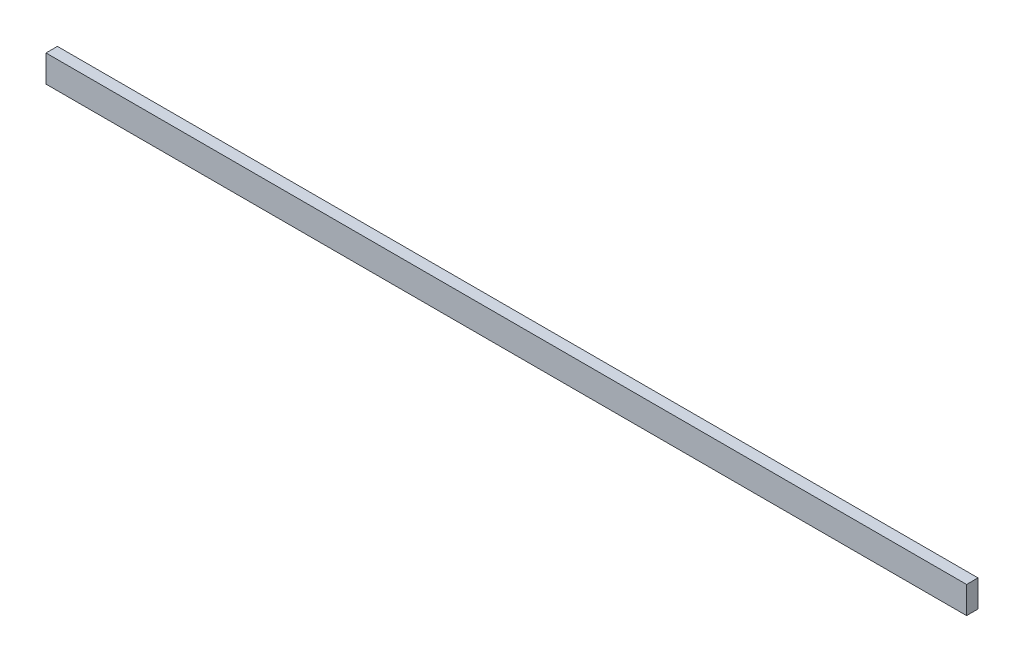
ISO-10303-21;
HEADER;
FILE_DESCRIPTION(('STEP AP214'),'2;1');
FILE_NAME('part.step','',(''),(''),'','','');
FILE_SCHEMA(('AUTOMOTIVE_DESIGN { 1 0 10303 214 1 1 1 1 }'));
ENDSEC;
DATA;
#1=APPLICATION_CONTEXT('core data for automotive mechanical design processes');
#2=APPLICATION_PROTOCOL_DEFINITION('international standard','automotive_design',2000,#1);
#3=PRODUCT_CONTEXT('',#1,'mechanical');
#4=PRODUCT('Part','Part','',(#3));
#5=PRODUCT_RELATED_PRODUCT_CATEGORY('part','',(#4));
#6=PRODUCT_DEFINITION_FORMATION('','',#4);
#7=PRODUCT_DEFINITION_CONTEXT('part definition',#1,'design');
#8=PRODUCT_DEFINITION('design','',#6,#7);
#9=PRODUCT_DEFINITION_SHAPE('','',#8);
#10=(LENGTH_UNIT() NAMED_UNIT(*) SI_UNIT(.MILLI.,.METRE.));
#11=(NAMED_UNIT(*) PLANE_ANGLE_UNIT() SI_UNIT($,.RADIAN.));
#12=(NAMED_UNIT(*) SI_UNIT($,.STERADIAN.) SOLID_ANGLE_UNIT());
#13=UNCERTAINTY_MEASURE_WITH_UNIT(LENGTH_MEASURE(1.E-05),#10,'distance_accuracy_value','');
#14=(GEOMETRIC_REPRESENTATION_CONTEXT(3) GLOBAL_UNCERTAINTY_ASSIGNED_CONTEXT((#13)) GLOBAL_UNIT_ASSIGNED_CONTEXT((#10,
#11,#12)) REPRESENTATION_CONTEXT('',''));
#15=CARTESIAN_POINT('',(0.,0.,0.));
#16=DIRECTION('',(0.,0.,1.));
#17=DIRECTION('',(1.,0.,0.));
#18=AXIS2_PLACEMENT_3D('',#15,#16,#17);
#19=CARTESIAN_POINT('',(0.,45.,-9.49999999999995));
#20=DIRECTION('',(1.,0.,0.));
#21=DIRECTION('',(0.,0.,-1.));
#22=AXIS2_PLACEMENT_3D('',#19,#20,#21);
#23=PLANE('',#22);
#24=DIRECTION('',(0.,0.,1.));
#25=VECTOR('',#24,1.);
#26=CARTESIAN_POINT('',(0.,0.,-9.49999999999995));
#27=LINE('',#26,#25);
#28=CARTESIAN_POINT('',(0.,0.,-9.49999999999995));
#29=VERTEX_POINT('',#28);
#30=CARTESIAN_POINT('',(0.,0.,9.49999999999995));
#31=VERTEX_POINT('',#30);
#32=EDGE_CURVE('E91',#29,#31,#27,.T.);
#33=ORIENTED_EDGE('',*,*,#32,.T.);
#34=DIRECTION('',(0.,-1.,0.));
#35=VECTOR('',#34,1.);
#36=CARTESIAN_POINT('',(0.,45.,9.49999999999995));
#37=LINE('',#36,#35);
#38=CARTESIAN_POINT('',(0.,45.,9.49999999999995));
#39=VERTEX_POINT('',#38);
#40=EDGE_CURVE('E11',#39,#31,#37,.T.);
#41=ORIENTED_EDGE('',*,*,#40,.F.);
#42=DIRECTION('',(0.,0.,1.));
#43=VECTOR('',#42,1.);
#44=CARTESIAN_POINT('',(0.,45.,-9.49999999999995));
#45=LINE('',#44,#43);
#46=CARTESIAN_POINT('',(0.,45.,-9.49999999999995));
#47=VERTEX_POINT('',#46);
#48=EDGE_CURVE('E79',#47,#39,#45,.T.);
#49=ORIENTED_EDGE('',*,*,#48,.F.);
#50=DIRECTION('',(0.,-1.,0.));
#51=VECTOR('',#50,1.);
#52=CARTESIAN_POINT('',(0.,45.,-9.49999999999995));
#53=LINE('',#52,#51);
#54=EDGE_CURVE('E87',#47,#29,#53,.T.);
#55=ORIENTED_EDGE('',*,*,#54,.T.);
#56=EDGE_LOOP('',(#33,#41,#49,#55));
#57=FACE_BOUND('',#56,.T.);
#58=ADVANCED_FACE('F28',(#57),#23,.F.);
#59=CARTESIAN_POINT('',(1533.9,45.,9.49999999999984));
#60=DIRECTION('',(0.,0.,-1.));
#61=DIRECTION('',(-1.,0.,0.));
#62=AXIS2_PLACEMENT_3D('',#59,#60,#61);
#63=PLANE('',#62);
#64=DIRECTION('',(1.,0.,0.));
#65=VECTOR('',#64,1.);
#66=CARTESIAN_POINT('',(1533.9,0.,9.49999999999984));
#67=LINE('',#66,#65);
#68=CARTESIAN_POINT('',(1533.9,0.,9.49999999999984));
#69=VERTEX_POINT('',#68);
#70=EDGE_CURVE('E83',#31,#69,#67,.T.);
#71=ORIENTED_EDGE('',*,*,#70,.T.);
#72=DIRECTION('',(0.,-1.,0.));
#73=VECTOR('',#72,1.);
#74=CARTESIAN_POINT('',(1533.9,45.,9.49999999999984));
#75=LINE('',#74,#73);
#76=CARTESIAN_POINT('',(1533.9,45.,9.49999999999984));
#77=VERTEX_POINT('',#76);
#78=EDGE_CURVE('E36',#77,#69,#75,.T.);
#79=ORIENTED_EDGE('',*,*,#78,.F.);
#80=DIRECTION('',(1.,0.,0.));
#81=VECTOR('',#80,1.);
#82=CARTESIAN_POINT('',(1533.9,45.,9.49999999999984));
#83=LINE('',#82,#81);
#84=EDGE_CURVE('E74',#39,#77,#83,.T.);
#85=ORIENTED_EDGE('',*,*,#84,.F.);
#86=ORIENTED_EDGE('',*,*,#40,.T.);
#87=EDGE_LOOP('',(#71,#79,#85,#86));
#88=FACE_BOUND('',#87,.T.);
#89=ADVANCED_FACE('F82',(#88),#63,.F.);
#90=CARTESIAN_POINT('',(1533.9,45.,-9.49999999999984));
#91=DIRECTION('',(-1.,0.,0.));
#92=DIRECTION('',(0.,0.,1.));
#93=AXIS2_PLACEMENT_3D('',#90,#91,#92);
#94=PLANE('',#93);
#95=DIRECTION('',(0.,0.,-1.));
#96=VECTOR('',#95,1.);
#97=CARTESIAN_POINT('',(1533.9,0.,-9.49999999999984));
#98=LINE('',#97,#96);
#99=CARTESIAN_POINT('',(1533.9,0.,-9.49999999999984));
#100=VERTEX_POINT('',#99);
#101=EDGE_CURVE('E61',#69,#100,#98,.T.);
#102=ORIENTED_EDGE('',*,*,#101,.T.);
#103=DIRECTION('',(0.,-1.,0.));
#104=VECTOR('',#103,1.);
#105=CARTESIAN_POINT('',(1533.9,45.,-9.49999999999984));
#106=LINE('',#105,#104);
#107=CARTESIAN_POINT('',(1533.9,45.,-9.49999999999984));
#108=VERTEX_POINT('',#107);
#109=EDGE_CURVE('E84',#108,#100,#106,.T.);
#110=ORIENTED_EDGE('',*,*,#109,.F.);
#111=DIRECTION('',(0.,0.,-1.));
#112=VECTOR('',#111,1.);
#113=CARTESIAN_POINT('',(1533.9,45.,-9.49999999999984));
#114=LINE('',#113,#112);
#115=EDGE_CURVE('E77',#77,#108,#114,.T.);
#116=ORIENTED_EDGE('',*,*,#115,.F.);
#117=ORIENTED_EDGE('',*,*,#78,.T.);
#118=EDGE_LOOP('',(#102,#110,#116,#117));
#119=FACE_BOUND('',#118,.T.);
#120=ADVANCED_FACE('F85',(#119),#94,.F.);
#121=CARTESIAN_POINT('',(1533.9,45.,-9.49999999999984));
#122=DIRECTION('',(0.,0.,1.));
#123=DIRECTION('',(1.,0.,0.));
#124=AXIS2_PLACEMENT_3D('',#121,#122,#123);
#125=PLANE('',#124);
#126=DIRECTION('',(-1.,0.,0.));
#127=VECTOR('',#126,1.);
#128=CARTESIAN_POINT('',(1533.9,0.,-9.49999999999984));
#129=LINE('',#128,#127);
#130=EDGE_CURVE('E67',#100,#29,#129,.T.);
#131=ORIENTED_EDGE('',*,*,#130,.T.);
#132=ORIENTED_EDGE('',*,*,#54,.F.);
#133=DIRECTION('',(-1.,0.,0.));
#134=VECTOR('',#133,1.);
#135=CARTESIAN_POINT('',(1533.9,45.,-9.49999999999984));
#136=LINE('',#135,#134);
#137=EDGE_CURVE('E44',#108,#47,#136,.T.);
#138=ORIENTED_EDGE('',*,*,#137,.F.);
#139=ORIENTED_EDGE('',*,*,#109,.T.);
#140=EDGE_LOOP('',(#131,#132,#138,#139));
#141=FACE_BOUND('',#140,.T.);
#142=ADVANCED_FACE('F98',(#141),#125,.F.);
#143=CARTESIAN_POINT('',(0.,45.,0.));
#144=DIRECTION('',(0.,-1.,0.));
#145=DIRECTION('',(0.,0.,-1.));
#146=AXIS2_PLACEMENT_3D('',#143,#144,#145);
#147=PLANE('',#146);
#148=ORIENTED_EDGE('',*,*,#48,.T.);
#149=ORIENTED_EDGE('',*,*,#84,.T.);
#150=ORIENTED_EDGE('',*,*,#115,.T.);
#151=ORIENTED_EDGE('',*,*,#137,.T.);
#152=EDGE_LOOP('',(#148,#149,#150,#151));
#153=FACE_BOUND('',#152,.T.);
#154=ADVANCED_FACE('F75',(#153),#147,.F.);
#155=CARTESIAN_POINT('',(0.,0.,0.));
#156=DIRECTION('',(0.,-1.,0.));
#157=DIRECTION('',(0.,0.,-1.));
#158=AXIS2_PLACEMENT_3D('',#155,#156,#157);
#159=PLANE('',#158);
#160=ORIENTED_EDGE('',*,*,#32,.F.);
#161=ORIENTED_EDGE('',*,*,#130,.F.);
#162=ORIENTED_EDGE('',*,*,#101,.F.);
#163=ORIENTED_EDGE('',*,*,#70,.F.);
#164=EDGE_LOOP('',(#160,#161,#162,#163));
#165=FACE_BOUND('',#164,.T.);
#166=ADVANCED_FACE('F101',(#165),#159,.T.);
#167=CLOSED_SHELL('',(#58,#89,#120,#142,#154,#166));
#168=MANIFOLD_SOLID_BREP('B2',#167);
#169=ADVANCED_BREP_SHAPE_REPRESENTATION('',(#18,#168),#14);
#170=SHAPE_DEFINITION_REPRESENTATION(#9,#169);
ENDSEC;
END-ISO-10303-21;
